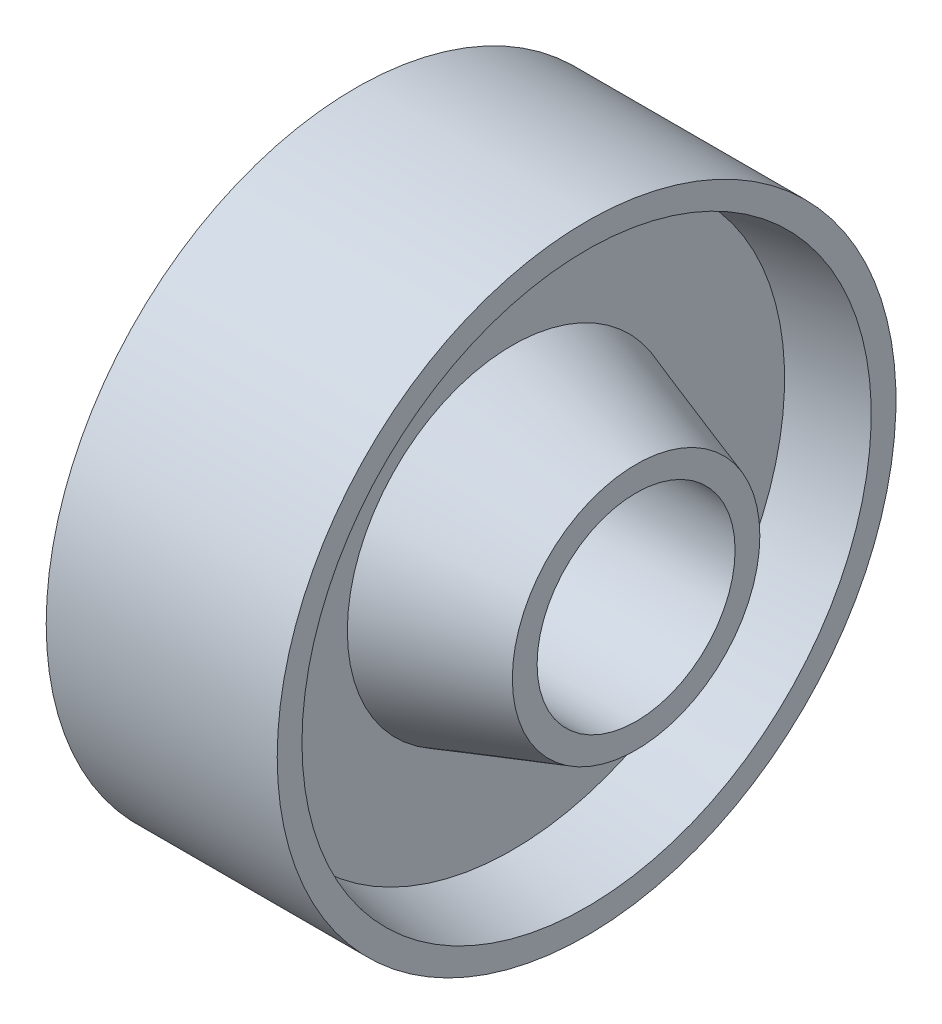
ISO-10303-21;
HEADER;
FILE_DESCRIPTION(('STEP AP214'),'2;1');
FILE_NAME('part.step','',(''),(''),'','','');
FILE_SCHEMA(('AUTOMOTIVE_DESIGN { 1 0 10303 214 1 1 1 1 }'));
ENDSEC;
DATA;
#1=APPLICATION_CONTEXT('core data for automotive mechanical design processes');
#2=APPLICATION_PROTOCOL_DEFINITION('international standard','automotive_design',2000,#1);
#3=PRODUCT_CONTEXT('',#1,'mechanical');
#4=PRODUCT('Part','Part','',(#3));
#5=PRODUCT_RELATED_PRODUCT_CATEGORY('part','',(#4));
#6=PRODUCT_DEFINITION_FORMATION('','',#4);
#7=PRODUCT_DEFINITION_CONTEXT('part definition',#1,'design');
#8=PRODUCT_DEFINITION('design','',#6,#7);
#9=PRODUCT_DEFINITION_SHAPE('','',#8);
#10=(LENGTH_UNIT() NAMED_UNIT(*) SI_UNIT(.MILLI.,.METRE.));
#11=(NAMED_UNIT(*) PLANE_ANGLE_UNIT() SI_UNIT($,.RADIAN.));
#12=(NAMED_UNIT(*) SI_UNIT($,.STERADIAN.) SOLID_ANGLE_UNIT());
#13=UNCERTAINTY_MEASURE_WITH_UNIT(LENGTH_MEASURE(1.E-05),#10,'distance_accuracy_value','');
#14=(GEOMETRIC_REPRESENTATION_CONTEXT(3) GLOBAL_UNCERTAINTY_ASSIGNED_CONTEXT((#13)) GLOBAL_UNIT_ASSIGNED_CONTEXT((#10,
#11,#12)) REPRESENTATION_CONTEXT('',''));
#15=CARTESIAN_POINT('',(0.,0.,0.));
#16=DIRECTION('',(0.,0.,1.));
#17=DIRECTION('',(1.,0.,0.));
#18=AXIS2_PLACEMENT_3D('',#15,#16,#17);
#19=CARTESIAN_POINT('',(20.,0.,0.));
#20=DIRECTION('',(-1.,0.,0.));
#21=DIRECTION('',(0.,0.,1.));
#22=AXIS2_PLACEMENT_3D('',#19,#20,#21);
#23=PLANE('',#22);
#24=CARTESIAN_POINT('',(20.,0.,0.));
#25=DIRECTION('',(-1.,0.,0.));
#26=DIRECTION('',(0.,0.,1.));
#27=AXIS2_PLACEMENT_3D('',#24,#25,#26);
#28=CIRCLE('',#27,15.);
#29=CARTESIAN_POINT('',(20.,0.,15.));
#30=VERTEX_POINT('',#29);
#31=EDGE_CURVE('E73',#30,#30,#28,.T.);
#32=ORIENTED_EDGE('',*,*,#31,.F.);
#33=EDGE_LOOP('',(#32));
#34=FACE_BOUND('',#33,.T.);
#35=CARTESIAN_POINT('',(20.,0.,0.));
#36=DIRECTION('',(-1.,0.,0.));
#37=DIRECTION('',(0.,0.,1.));
#38=AXIS2_PLACEMENT_3D('',#35,#36,#37);
#39=CIRCLE('',#38,12.);
#40=CARTESIAN_POINT('',(20.,0.,12.));
#41=VERTEX_POINT('',#40);
#42=EDGE_CURVE('E10',#41,#41,#39,.T.);
#43=ORIENTED_EDGE('',*,*,#42,.T.);
#44=EDGE_LOOP('',(#43));
#45=FACE_BOUND('',#44,.T.);
#46=ADVANCED_FACE('F33',(#34,#45),#23,.F.);
#47=CARTESIAN_POINT('',(0.,0.,0.));
#48=DIRECTION('',(-1.,0.,0.));
#49=DIRECTION('',(0.,0.,1.));
#50=AXIS2_PLACEMENT_3D('',#47,#48,#49);
#51=CYLINDRICAL_SURFACE('',#50,12.);
#52=ORIENTED_EDGE('',*,*,#42,.F.);
#53=EDGE_LOOP('',(#52));
#54=FACE_BOUND('',#53,.T.);
#55=CARTESIAN_POINT('',(-20.,0.,0.));
#56=DIRECTION('',(-1.,0.,0.));
#57=DIRECTION('',(0.,0.,1.));
#58=AXIS2_PLACEMENT_3D('',#55,#56,#57);
#59=CIRCLE('',#58,12.);
#60=CARTESIAN_POINT('',(-20.,0.,12.));
#61=VERTEX_POINT('',#60);
#62=EDGE_CURVE('E39',#61,#61,#59,.T.);
#63=ORIENTED_EDGE('',*,*,#62,.T.);
#64=EDGE_LOOP('',(#63));
#65=FACE_BOUND('',#64,.T.);
#66=ADVANCED_FACE('F80',(#54,#65),#51,.F.);
#67=CARTESIAN_POINT('',(-20.,0.,0.));
#68=DIRECTION('',(-1.,0.,0.));
#69=DIRECTION('',(0.,0.,1.));
#70=AXIS2_PLACEMENT_3D('',#67,#68,#69);
#71=PLANE('',#70);
#72=CARTESIAN_POINT('',(-20.,0.,0.));
#73=DIRECTION('',(-1.,0.,0.));
#74=DIRECTION('',(0.,0.,1.));
#75=AXIS2_PLACEMENT_3D('',#72,#73,#74);
#76=CIRCLE('',#75,15.);
#77=CARTESIAN_POINT('',(-20.,0.,15.));
#78=VERTEX_POINT('',#77);
#79=EDGE_CURVE('E43',#78,#78,#76,.T.);
#80=ORIENTED_EDGE('',*,*,#79,.T.);
#81=EDGE_LOOP('',(#80));
#82=FACE_BOUND('',#81,.T.);
#83=ORIENTED_EDGE('',*,*,#62,.F.);
#84=EDGE_LOOP('',(#83));
#85=FACE_BOUND('',#84,.T.);
#86=ADVANCED_FACE('F84',(#82,#85),#71,.T.);
#87=CARTESIAN_POINT('',(-20.,0.,0.));
#88=DIRECTION('',(1.,0.,0.));
#89=DIRECTION('',(0.,0.,-1.));
#90=AXIS2_PLACEMENT_3D('',#87,#88,#89);
#91=CONICAL_SURFACE('',#90,15.,0.321750554396642);
#92=CARTESIAN_POINT('',(-5.,0.,0.));
#93=DIRECTION('',(-1.,0.,0.));
#94=DIRECTION('',(0.,0.,1.));
#95=AXIS2_PLACEMENT_3D('',#92,#93,#94);
#96=CIRCLE('',#95,20.);
#97=CARTESIAN_POINT('',(-5.,0.,20.));
#98=VERTEX_POINT('',#97);
#99=EDGE_CURVE('E47',#98,#98,#96,.T.);
#100=ORIENTED_EDGE('',*,*,#99,.T.);
#101=EDGE_LOOP('',(#100));
#102=FACE_BOUND('',#101,.T.);
#103=ORIENTED_EDGE('',*,*,#79,.F.);
#104=EDGE_LOOP('',(#103));
#105=FACE_BOUND('',#104,.T.);
#106=ADVANCED_FACE('F89',(#102,#105),#91,.T.);
#107=CARTESIAN_POINT('',(-5.,0.,0.));
#108=DIRECTION('',(-1.,0.,0.));
#109=DIRECTION('',(0.,0.,1.));
#110=AXIS2_PLACEMENT_3D('',#107,#108,#109);
#111=PLANE('',#110);
#112=CARTESIAN_POINT('',(-5.,0.,0.));
#113=DIRECTION('',(-1.,0.,0.));
#114=DIRECTION('',(0.,0.,1.));
#115=AXIS2_PLACEMENT_3D('',#112,#113,#114);
#116=CIRCLE('',#115,33.);
#117=CARTESIAN_POINT('',(-5.,0.,33.));
#118=VERTEX_POINT('',#117);
#119=EDGE_CURVE('E52',#118,#118,#116,.T.);
#120=ORIENTED_EDGE('',*,*,#119,.T.);
#121=EDGE_LOOP('',(#120));
#122=FACE_BOUND('',#121,.T.);
#123=ORIENTED_EDGE('',*,*,#99,.F.);
#124=EDGE_LOOP('',(#123));
#125=FACE_BOUND('',#124,.T.);
#126=ADVANCED_FACE('F95',(#122,#125),#111,.T.);
#127=CARTESIAN_POINT('',(-5.,0.,0.));
#128=DIRECTION('',(-1.,0.,0.));
#129=DIRECTION('',(0.,0.,1.));
#130=AXIS2_PLACEMENT_3D('',#127,#128,#129);
#131=CONICAL_SURFACE('',#130,33.,0.165148677414628);
#132=CARTESIAN_POINT('',(-14.,0.,0.));
#133=DIRECTION('',(-1.,0.,0.));
#134=DIRECTION('',(0.,0.,1.));
#135=AXIS2_PLACEMENT_3D('',#132,#133,#134);
#136=CIRCLE('',#135,34.5);
#137=CARTESIAN_POINT('',(-14.,0.,34.5));
#138=VERTEX_POINT('',#137);
#139=EDGE_CURVE('E55',#138,#138,#136,.T.);
#140=ORIENTED_EDGE('',*,*,#139,.T.);
#141=EDGE_LOOP('',(#140));
#142=FACE_BOUND('',#141,.T.);
#143=ORIENTED_EDGE('',*,*,#119,.F.);
#144=EDGE_LOOP('',(#143));
#145=FACE_BOUND('',#144,.T.);
#146=ADVANCED_FACE('F99',(#142,#145),#131,.F.);
#147=CARTESIAN_POINT('',(-14.,0.,0.));
#148=DIRECTION('',(-1.,0.,0.));
#149=DIRECTION('',(0.,0.,1.));
#150=AXIS2_PLACEMENT_3D('',#147,#148,#149);
#151=PLANE('',#150);
#152=CARTESIAN_POINT('',(-14.,0.,0.));
#153=DIRECTION('',(-1.,0.,0.));
#154=DIRECTION('',(0.,0.,1.));
#155=AXIS2_PLACEMENT_3D('',#152,#153,#154);
#156=CIRCLE('',#155,37.5);
#157=CARTESIAN_POINT('',(-14.,0.,37.5));
#158=VERTEX_POINT('',#157);
#159=EDGE_CURVE('E58',#158,#158,#156,.T.);
#160=ORIENTED_EDGE('',*,*,#159,.T.);
#161=EDGE_LOOP('',(#160));
#162=FACE_BOUND('',#161,.T.);
#163=ORIENTED_EDGE('',*,*,#139,.F.);
#164=EDGE_LOOP('',(#163));
#165=FACE_BOUND('',#164,.T.);
#166=ADVANCED_FACE('F103',(#162,#165),#151,.T.);
#167=CARTESIAN_POINT('',(0.,0.,0.));
#168=DIRECTION('',(-1.,0.,0.));
#169=DIRECTION('',(0.,0.,1.));
#170=AXIS2_PLACEMENT_3D('',#167,#168,#169);
#171=CYLINDRICAL_SURFACE('',#170,37.5);
#172=CARTESIAN_POINT('',(14.,0.,0.));
#173=DIRECTION('',(-1.,0.,0.));
#174=DIRECTION('',(0.,0.,1.));
#175=AXIS2_PLACEMENT_3D('',#172,#173,#174);
#176=CIRCLE('',#175,37.5);
#177=CARTESIAN_POINT('',(14.,0.,37.5));
#178=VERTEX_POINT('',#177);
#179=EDGE_CURVE('E61',#178,#178,#176,.T.);
#180=ORIENTED_EDGE('',*,*,#179,.T.);
#181=EDGE_LOOP('',(#180));
#182=FACE_BOUND('',#181,.T.);
#183=ORIENTED_EDGE('',*,*,#159,.F.);
#184=EDGE_LOOP('',(#183));
#185=FACE_BOUND('',#184,.T.);
#186=ADVANCED_FACE('F107',(#182,#185),#171,.T.);
#187=CARTESIAN_POINT('',(14.,0.,0.));
#188=DIRECTION('',(-1.,0.,0.));
#189=DIRECTION('',(0.,0.,1.));
#190=AXIS2_PLACEMENT_3D('',#187,#188,#189);
#191=PLANE('',#190);
#192=ORIENTED_EDGE('',*,*,#179,.F.);
#193=EDGE_LOOP('',(#192));
#194=FACE_BOUND('',#193,.T.);
#195=CARTESIAN_POINT('',(14.,0.,0.));
#196=DIRECTION('',(-1.,0.,0.));
#197=DIRECTION('',(0.,0.,1.));
#198=AXIS2_PLACEMENT_3D('',#195,#196,#197);
#199=CIRCLE('',#198,34.5);
#200=CARTESIAN_POINT('',(14.,0.,34.5));
#201=VERTEX_POINT('',#200);
#202=EDGE_CURVE('E64',#201,#201,#199,.T.);
#203=ORIENTED_EDGE('',*,*,#202,.T.);
#204=EDGE_LOOP('',(#203));
#205=FACE_BOUND('',#204,.T.);
#206=ADVANCED_FACE('F111',(#194,#205),#191,.F.);
#207=CARTESIAN_POINT('',(5.,0.,0.));
#208=DIRECTION('',(1.,0.,0.));
#209=DIRECTION('',(0.,0.,-1.));
#210=AXIS2_PLACEMENT_3D('',#207,#208,#209);
#211=CONICAL_SURFACE('',#210,33.,0.165148677414627);
#212=ORIENTED_EDGE('',*,*,#202,.F.);
#213=EDGE_LOOP('',(#212));
#214=FACE_BOUND('',#213,.T.);
#215=CARTESIAN_POINT('',(5.,0.,0.));
#216=DIRECTION('',(-1.,0.,0.));
#217=DIRECTION('',(0.,0.,1.));
#218=AXIS2_PLACEMENT_3D('',#215,#216,#217);
#219=CIRCLE('',#218,33.);
#220=CARTESIAN_POINT('',(5.,0.,33.));
#221=VERTEX_POINT('',#220);
#222=EDGE_CURVE('E67',#221,#221,#219,.T.);
#223=ORIENTED_EDGE('',*,*,#222,.T.);
#224=EDGE_LOOP('',(#223));
#225=FACE_BOUND('',#224,.T.);
#226=ADVANCED_FACE('F115',(#214,#225),#211,.F.);
#227=CARTESIAN_POINT('',(5.,0.,0.));
#228=DIRECTION('',(-1.,0.,0.));
#229=DIRECTION('',(0.,0.,1.));
#230=AXIS2_PLACEMENT_3D('',#227,#228,#229);
#231=PLANE('',#230);
#232=ORIENTED_EDGE('',*,*,#222,.F.);
#233=EDGE_LOOP('',(#232));
#234=FACE_BOUND('',#233,.T.);
#235=CARTESIAN_POINT('',(5.,0.,0.));
#236=DIRECTION('',(-1.,0.,0.));
#237=DIRECTION('',(0.,0.,1.));
#238=AXIS2_PLACEMENT_3D('',#235,#236,#237);
#239=CIRCLE('',#238,20.);
#240=CARTESIAN_POINT('',(5.,0.,20.));
#241=VERTEX_POINT('',#240);
#242=EDGE_CURVE('E70',#241,#241,#239,.T.);
#243=ORIENTED_EDGE('',*,*,#242,.T.);
#244=EDGE_LOOP('',(#243));
#245=FACE_BOUND('',#244,.T.);
#246=ADVANCED_FACE('F119',(#234,#245),#231,.F.);
#247=CARTESIAN_POINT('',(20.,0.,0.));
#248=DIRECTION('',(-1.,0.,0.));
#249=DIRECTION('',(0.,0.,1.));
#250=AXIS2_PLACEMENT_3D('',#247,#248,#249);
#251=CONICAL_SURFACE('',#250,15.,0.321750554396642);
#252=ORIENTED_EDGE('',*,*,#242,.F.);
#253=EDGE_LOOP('',(#252));
#254=FACE_BOUND('',#253,.T.);
#255=ORIENTED_EDGE('',*,*,#31,.T.);
#256=EDGE_LOOP('',(#255));
#257=FACE_BOUND('',#256,.T.);
#258=ADVANCED_FACE('F77',(#254,#257),#251,.T.);
#259=CLOSED_SHELL('',(#46,#66,#86,#106,#126,#146,#166,#186,#206,#226,#246,#258));
#260=MANIFOLD_SOLID_BREP('B2',#259);
#261=ADVANCED_BREP_SHAPE_REPRESENTATION('',(#18,#260),#14);
#262=SHAPE_DEFINITION_REPRESENTATION(#9,#261);
ENDSEC;
END-ISO-10303-21;
